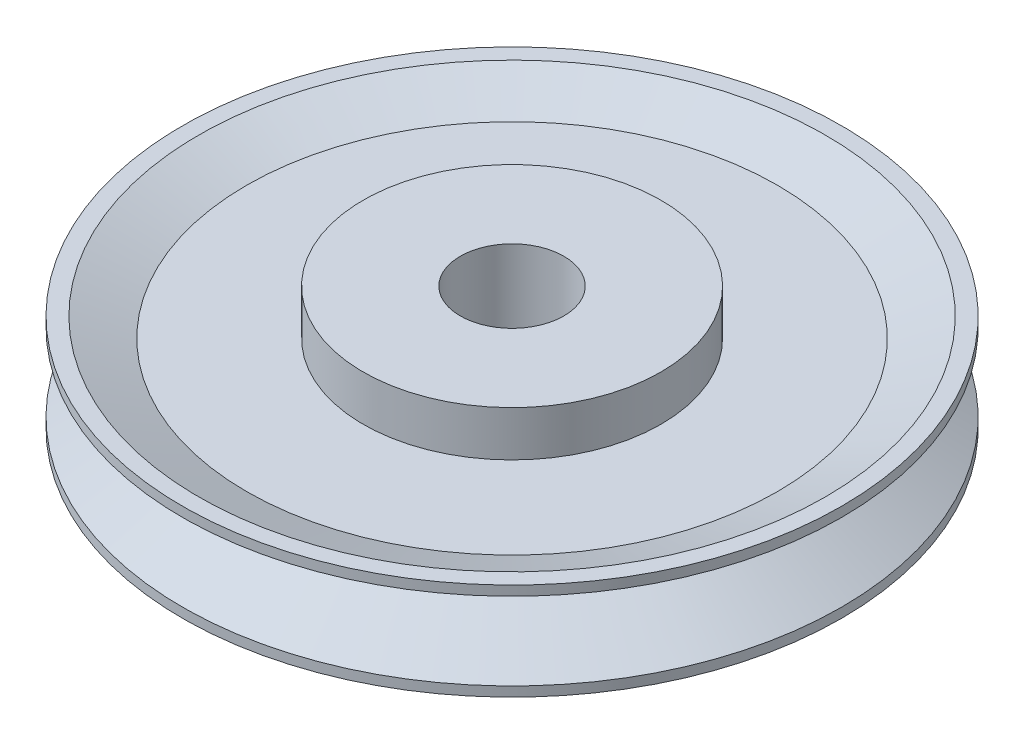
ISO-10303-21;
HEADER;
FILE_DESCRIPTION(('STEP AP214'),'2;1');
FILE_NAME('part.step','',(''),(''),'','','');
FILE_SCHEMA(('AUTOMOTIVE_DESIGN { 1 0 10303 214 1 1 1 1 }'));
ENDSEC;
DATA;
#1=APPLICATION_CONTEXT('core data for automotive mechanical design processes');
#2=APPLICATION_PROTOCOL_DEFINITION('international standard','automotive_design',2000,#1);
#3=PRODUCT_CONTEXT('',#1,'mechanical');
#4=PRODUCT('Part','Part','',(#3));
#5=PRODUCT_RELATED_PRODUCT_CATEGORY('part','',(#4));
#6=PRODUCT_DEFINITION_FORMATION('','',#4);
#7=PRODUCT_DEFINITION_CONTEXT('part definition',#1,'design');
#8=PRODUCT_DEFINITION('design','',#6,#7);
#9=PRODUCT_DEFINITION_SHAPE('','',#8);
#10=(LENGTH_UNIT() NAMED_UNIT(*) SI_UNIT(.MILLI.,.METRE.));
#11=(NAMED_UNIT(*) PLANE_ANGLE_UNIT() SI_UNIT($,.RADIAN.));
#12=(NAMED_UNIT(*) SI_UNIT($,.STERADIAN.) SOLID_ANGLE_UNIT());
#13=UNCERTAINTY_MEASURE_WITH_UNIT(LENGTH_MEASURE(1.E-05),#10,'distance_accuracy_value','');
#14=(GEOMETRIC_REPRESENTATION_CONTEXT(3) GLOBAL_UNCERTAINTY_ASSIGNED_CONTEXT((#13)) GLOBAL_UNIT_ASSIGNED_CONTEXT((#10,
#11,#12)) REPRESENTATION_CONTEXT('',''));
#15=CARTESIAN_POINT('',(0.,0.,0.));
#16=DIRECTION('',(0.,0.,1.));
#17=DIRECTION('',(1.,0.,0.));
#18=AXIS2_PLACEMENT_3D('',#15,#16,#17);
#19=CARTESIAN_POINT('',(-2.03200000000001,-2.54000000000001,0.));
#20=DIRECTION('',(0.,-1.,0.));
#21=DIRECTION('',(1.,0.,0.));
#22=AXIS2_PLACEMENT_3D('',#19,#20,#21);
#23=CYLINDRICAL_SURFACE('',#22,5.842);
#24=CARTESIAN_POINT('',(-2.032,-1.82830729554373,0.));
#25=DIRECTION('',(0.,-1.,0.));
#26=DIRECTION('',(1.,0.,0.));
#27=AXIS2_PLACEMENT_3D('',#24,#25,#26);
#28=CIRCLE('',#27,5.842);
#29=CARTESIAN_POINT('',(3.81,-1.82830729554373,0.));
#30=VERTEX_POINT('',#29);
#31=EDGE_CURVE('E12',#30,#30,#28,.T.);
#32=ORIENTED_EDGE('',*,*,#31,.T.);
#33=EDGE_LOOP('',(#32));
#34=FACE_BOUND('',#33,.T.);
#35=CARTESIAN_POINT('',(-2.032,-3.60630729554365,0.));
#36=DIRECTION('',(0.,-1.,0.));
#37=DIRECTION('',(1.,0.,0.));
#38=AXIS2_PLACEMENT_3D('',#35,#36,#37);
#39=CIRCLE('',#38,5.842);
#40=CARTESIAN_POINT('',(3.81,-3.60630729554365,0.));
#41=VERTEX_POINT('',#40);
#42=EDGE_CURVE('E92',#41,#41,#39,.T.);
#43=ORIENTED_EDGE('',*,*,#42,.F.);
#44=EDGE_LOOP('',(#43));
#45=FACE_BOUND('',#44,.T.);
#46=ADVANCED_FACE('F42',(#34,#45),#23,.T.);
#47=CARTESIAN_POINT('',(0.,-1.82830729554363,0.));
#48=DIRECTION('',(0.,-1.,0.));
#49=DIRECTION('',(1.,0.,0.));
#50=AXIS2_PLACEMENT_3D('',#47,#48,#49);
#51=PLANE('',#50);
#52=CARTESIAN_POINT('',(-2.032,-1.82830729554373,0.));
#53=DIRECTION('',(0.,-1.,0.));
#54=DIRECTION('',(1.,0.,0.));
#55=AXIS2_PLACEMENT_3D('',#52,#53,#54);
#56=CIRCLE('',#55,10.414);
#57=CARTESIAN_POINT('',(8.382,-1.82830729554373,0.));
#58=VERTEX_POINT('',#57);
#59=EDGE_CURVE('E49',#58,#58,#56,.T.);
#60=ORIENTED_EDGE('',*,*,#59,.T.);
#61=EDGE_LOOP('',(#60));
#62=FACE_BOUND('',#61,.T.);
#63=ORIENTED_EDGE('',*,*,#31,.F.);
#64=EDGE_LOOP('',(#63));
#65=FACE_BOUND('',#64,.T.);
#66=ADVANCED_FACE('F44',(#62,#65),#51,.T.);
#67=CARTESIAN_POINT('',(-2.032,-1.82830729554373,0.));
#68=DIRECTION('',(0.,-1.,0.));
#69=DIRECTION('',(1.,0.,0.));
#70=AXIS2_PLACEMENT_3D('',#67,#68,#69);
#71=CONICAL_SURFACE('',#70,10.414,1.18639955229926);
#72=CARTESIAN_POINT('',(-2.032,-2.59030729554366,0.));
#73=DIRECTION('',(0.,-1.,0.));
#74=DIRECTION('',(1.,0.,0.));
#75=AXIS2_PLACEMENT_3D('',#72,#73,#74);
#76=CIRCLE('',#75,12.2977144157223);
#77=CARTESIAN_POINT('',(10.2657144157223,-2.59030729554366,0.));
#78=VERTEX_POINT('',#77);
#79=EDGE_CURVE('E53',#78,#78,#76,.T.);
#80=ORIENTED_EDGE('',*,*,#79,.T.);
#81=EDGE_LOOP('',(#80));
#82=FACE_BOUND('',#81,.T.);
#83=ORIENTED_EDGE('',*,*,#59,.F.);
#84=EDGE_LOOP('',(#83));
#85=FACE_BOUND('',#84,.T.);
#86=ADVANCED_FACE('F105',(#82,#85),#71,.F.);
#87=CARTESIAN_POINT('',(0.,-2.59030729554363,0.));
#88=DIRECTION('',(0.,-1.,0.));
#89=DIRECTION('',(1.,0.,0.));
#90=AXIS2_PLACEMENT_3D('',#87,#88,#89);
#91=PLANE('',#90);
#92=CARTESIAN_POINT('',(-2.032,-2.59030729554366,0.));
#93=DIRECTION('',(0.,-1.,0.));
#94=DIRECTION('',(1.,0.,0.));
#95=AXIS2_PLACEMENT_3D('',#92,#93,#94);
#96=CIRCLE('',#95,12.9327144157223);
#97=CARTESIAN_POINT('',(10.9007144157223,-2.59030729554366,0.));
#98=VERTEX_POINT('',#97);
#99=EDGE_CURVE('E57',#98,#98,#96,.T.);
#100=ORIENTED_EDGE('',*,*,#99,.T.);
#101=EDGE_LOOP('',(#100));
#102=FACE_BOUND('',#101,.T.);
#103=ORIENTED_EDGE('',*,*,#79,.F.);
#104=EDGE_LOOP('',(#103));
#105=FACE_BOUND('',#104,.T.);
#106=ADVANCED_FACE('F151',(#102,#105),#91,.T.);
#107=CARTESIAN_POINT('',(-2.03200000000001,-2.54000000000001,0.));
#108=DIRECTION('',(0.,-1.,0.));
#109=DIRECTION('',(1.,0.,0.));
#110=AXIS2_PLACEMENT_3D('',#107,#108,#109);
#111=CYLINDRICAL_SURFACE('',#110,12.9327144157223);
#112=CARTESIAN_POINT('',(-2.032,-2.20930729554364,0.));
#113=DIRECTION('',(0.,-1.,0.));
#114=DIRECTION('',(1.,0.,0.));
#115=AXIS2_PLACEMENT_3D('',#112,#113,#114);
#116=CIRCLE('',#115,12.9327144157223);
#117=CARTESIAN_POINT('',(10.9007144157223,-2.20930729554364,0.));
#118=VERTEX_POINT('',#117);
#119=EDGE_CURVE('E62',#118,#118,#116,.T.);
#120=ORIENTED_EDGE('',*,*,#119,.T.);
#121=EDGE_LOOP('',(#120));
#122=FACE_BOUND('',#121,.T.);
#123=ORIENTED_EDGE('',*,*,#99,.F.);
#124=EDGE_LOOP('',(#123));
#125=FACE_BOUND('',#124,.T.);
#126=ADVANCED_FACE('F147',(#122,#125),#111,.T.);
#127=CARTESIAN_POINT('',(-2.032,-2.20930729554364,0.));
#128=DIRECTION('',(0.,-1.,0.));
#129=DIRECTION('',(1.,0.,0.));
#130=AXIS2_PLACEMENT_3D('',#127,#128,#129);
#131=CONICAL_SURFACE('',#130,12.9327144157223,1.00129298133675);
#132=CARTESIAN_POINT('',(-2.032,-0.685307295543724,0.));
#133=DIRECTION('',(0.,-1.,0.));
#134=DIRECTION('',(1.,0.,0.));
#135=AXIS2_PLACEMENT_3D('',#132,#133,#134);
#136=CIRCLE('',#135,10.5524614226603);
#137=CARTESIAN_POINT('',(8.52046142266035,-0.685307295543722,0.));
#138=VERTEX_POINT('',#137);
#139=EDGE_CURVE('E65',#138,#138,#136,.T.);
#140=ORIENTED_EDGE('',*,*,#139,.T.);
#141=EDGE_LOOP('',(#140));
#142=FACE_BOUND('',#141,.T.);
#143=ORIENTED_EDGE('',*,*,#119,.F.);
#144=EDGE_LOOP('',(#143));
#145=FACE_BOUND('',#144,.T.);
#146=ADVANCED_FACE('F143',(#142,#145),#131,.T.);
#147=CARTESIAN_POINT('',(-2.032,-0.685307295543724,0.));
#148=DIRECTION('',(0.,1.,0.));
#149=DIRECTION('',(-1.,0.,0.));
#150=AXIS2_PLACEMENT_3D('',#147,#148,#149);
#151=CONICAL_SURFACE('',#150,10.5524614226603,1.00129298133675);
#152=CARTESIAN_POINT('',(-2.032,0.838692704456273,0.));
#153=DIRECTION('',(0.,-1.,0.));
#154=DIRECTION('',(1.,0.,0.));
#155=AXIS2_PLACEMENT_3D('',#152,#153,#154);
#156=CIRCLE('',#155,12.9327144157223);
#157=CARTESIAN_POINT('',(10.9007144157223,0.838692704456276,0.));
#158=VERTEX_POINT('',#157);
#159=EDGE_CURVE('E68',#158,#158,#156,.T.);
#160=ORIENTED_EDGE('',*,*,#159,.T.);
#161=EDGE_LOOP('',(#160));
#162=FACE_BOUND('',#161,.T.);
#163=ORIENTED_EDGE('',*,*,#139,.F.);
#164=EDGE_LOOP('',(#163));
#165=FACE_BOUND('',#164,.T.);
#166=ADVANCED_FACE('F139',(#162,#165),#151,.T.);
#167=CARTESIAN_POINT('',(-2.03200000000001,-2.54000000000001,0.));
#168=DIRECTION('',(0.,-1.,0.));
#169=DIRECTION('',(1.,0.,0.));
#170=AXIS2_PLACEMENT_3D('',#167,#168,#169);
#171=CYLINDRICAL_SURFACE('',#170,12.9327144157223);
#172=CARTESIAN_POINT('',(-2.03200000000001,1.21969270445627,0.));
#173=DIRECTION('',(0.,-1.,0.));
#174=DIRECTION('',(1.,0.,0.));
#175=AXIS2_PLACEMENT_3D('',#172,#173,#174);
#176=CIRCLE('',#175,12.9327144157223);
#177=CARTESIAN_POINT('',(10.9007144157223,1.21969270445627,0.));
#178=VERTEX_POINT('',#177);
#179=EDGE_CURVE('E71',#178,#178,#176,.T.);
#180=ORIENTED_EDGE('',*,*,#179,.T.);
#181=EDGE_LOOP('',(#180));
#182=FACE_BOUND('',#181,.T.);
#183=ORIENTED_EDGE('',*,*,#159,.F.);
#184=EDGE_LOOP('',(#183));
#185=FACE_BOUND('',#184,.T.);
#186=ADVANCED_FACE('F135',(#182,#185),#171,.T.);
#187=CARTESIAN_POINT('',(0.,1.21969270445636,0.));
#188=DIRECTION('',(0.,1.,0.));
#189=DIRECTION('',(-1.,0.,0.));
#190=AXIS2_PLACEMENT_3D('',#187,#188,#189);
#191=PLANE('',#190);
#192=CARTESIAN_POINT('',(-2.03200000000001,1.21969270445627,0.));
#193=DIRECTION('',(0.,-1.,0.));
#194=DIRECTION('',(1.,0.,0.));
#195=AXIS2_PLACEMENT_3D('',#192,#193,#194);
#196=CIRCLE('',#195,12.2977144157223);
#197=CARTESIAN_POINT('',(10.2657144157223,1.21969270445627,0.));
#198=VERTEX_POINT('',#197);
#199=EDGE_CURVE('E74',#198,#198,#196,.T.);
#200=ORIENTED_EDGE('',*,*,#199,.T.);
#201=EDGE_LOOP('',(#200));
#202=FACE_BOUND('',#201,.T.);
#203=ORIENTED_EDGE('',*,*,#179,.F.);
#204=EDGE_LOOP('',(#203));
#205=FACE_BOUND('',#204,.T.);
#206=ADVANCED_FACE('F128',(#202,#205),#191,.T.);
#207=CARTESIAN_POINT('',(-2.03200000000001,0.457692704456267,0.));
#208=DIRECTION('',(0.,1.,0.));
#209=DIRECTION('',(-1.,0.,0.));
#210=AXIS2_PLACEMENT_3D('',#207,#208,#209);
#211=CONICAL_SURFACE('',#210,10.414,1.18639955229926);
#212=ORIENTED_EDGE('',*,*,#199,.F.);
#213=EDGE_LOOP('',(#212));
#214=FACE_BOUND('',#213,.T.);
#215=CARTESIAN_POINT('',(-2.03200000000001,0.457692704456267,0.));
#216=DIRECTION('',(0.,-1.,0.));
#217=DIRECTION('',(1.,0.,0.));
#218=AXIS2_PLACEMENT_3D('',#215,#216,#217);
#219=CIRCLE('',#218,10.414);
#220=CARTESIAN_POINT('',(8.38199999999999,0.457692704456269,0.));
#221=VERTEX_POINT('',#220);
#222=EDGE_CURVE('E77',#221,#221,#219,.T.);
#223=ORIENTED_EDGE('',*,*,#222,.T.);
#224=EDGE_LOOP('',(#223));
#225=FACE_BOUND('',#224,.T.);
#226=ADVANCED_FACE('F118',(#214,#225),#211,.F.);
#227=CARTESIAN_POINT('',(0.,0.457692704456364,0.));
#228=DIRECTION('',(0.,-1.,0.));
#229=DIRECTION('',(1.,0.,0.));
#230=AXIS2_PLACEMENT_3D('',#227,#228,#229);
#231=PLANE('',#230);
#232=ORIENTED_EDGE('',*,*,#222,.F.);
#233=EDGE_LOOP('',(#232));
#234=FACE_BOUND('',#233,.T.);
#235=CARTESIAN_POINT('',(-2.03200000000001,0.457692704456267,0.));
#236=DIRECTION('',(0.,-1.,0.));
#237=DIRECTION('',(1.,0.,0.));
#238=AXIS2_PLACEMENT_3D('',#235,#236,#237);
#239=CIRCLE('',#238,5.842);
#240=CARTESIAN_POINT('',(3.80999999999999,0.457692704456268,0.));
#241=VERTEX_POINT('',#240);
#242=EDGE_CURVE('E80',#241,#241,#239,.T.);
#243=ORIENTED_EDGE('',*,*,#242,.T.);
#244=EDGE_LOOP('',(#243));
#245=FACE_BOUND('',#244,.T.);
#246=ADVANCED_FACE('F110',(#234,#245),#231,.F.);
#247=CARTESIAN_POINT('',(-2.03200000000001,2.23569270445637,0.));
#248=DIRECTION('',(0.,-1.,0.));
#249=DIRECTION('',(1.,0.,0.));
#250=AXIS2_PLACEMENT_3D('',#247,#248,#249);
#251=CIRCLE('',#250,5.842);
#252=CARTESIAN_POINT('',(3.80999999999999,2.23569270445637,0.));
#253=VERTEX_POINT('',#252);
#254=EDGE_CURVE('E83',#253,#253,#251,.T.);
#255=ORIENTED_EDGE('',*,*,#254,.T.);
#256=EDGE_LOOP('',(#255));
#257=FACE_BOUND('',#256,.T.);
#258=ORIENTED_EDGE('',*,*,#242,.F.);
#259=EDGE_LOOP('',(#258));
#260=FACE_BOUND('',#259,.T.);
#261=ADVANCED_FACE('F101',(#257,#260),#23,.T.);
#262=CARTESIAN_POINT('',(0.,2.23569270445637,0.));
#263=DIRECTION('',(0.,1.,0.));
#264=DIRECTION('',(-1.,0.,0.));
#265=AXIS2_PLACEMENT_3D('',#262,#263,#264);
#266=PLANE('',#265);
#267=CARTESIAN_POINT('',(-2.03200000000001,2.23569270445637,0.));
#268=DIRECTION('',(0.,-1.,0.));
#269=DIRECTION('',(1.,0.,0.));
#270=AXIS2_PLACEMENT_3D('',#267,#268,#269);
#271=CIRCLE('',#270,2.032);
#272=CARTESIAN_POINT('',(0.,2.23569270445637,0.));
#273=VERTEX_POINT('',#272);
#274=EDGE_CURVE('E86',#273,#273,#271,.T.);
#275=ORIENTED_EDGE('',*,*,#274,.T.);
#276=EDGE_LOOP('',(#275));
#277=FACE_BOUND('',#276,.T.);
#278=ORIENTED_EDGE('',*,*,#254,.F.);
#279=EDGE_LOOP('',(#278));
#280=FACE_BOUND('',#279,.T.);
#281=ADVANCED_FACE('F109',(#277,#280),#266,.T.);
#282=CARTESIAN_POINT('',(-2.03200000000001,-2.54000000000001,0.));
#283=DIRECTION('',(0.,-1.,0.));
#284=DIRECTION('',(1.,0.,0.));
#285=AXIS2_PLACEMENT_3D('',#282,#283,#284);
#286=CYLINDRICAL_SURFACE('',#285,2.032);
#287=CARTESIAN_POINT('',(-2.032,-3.60630729554365,0.));
#288=DIRECTION('',(0.,-1.,0.));
#289=DIRECTION('',(1.,0.,0.));
#290=AXIS2_PLACEMENT_3D('',#287,#288,#289);
#291=CIRCLE('',#290,2.032);
#292=CARTESIAN_POINT('',(0.,-3.60630729554365,0.));
#293=VERTEX_POINT('',#292);
#294=EDGE_CURVE('E89',#293,#293,#291,.T.);
#295=ORIENTED_EDGE('',*,*,#294,.T.);
#296=EDGE_LOOP('',(#295));
#297=FACE_BOUND('',#296,.T.);
#298=ORIENTED_EDGE('',*,*,#274,.F.);
#299=EDGE_LOOP('',(#298));
#300=FACE_BOUND('',#299,.T.);
#301=ADVANCED_FACE('F116',(#297,#300),#286,.F.);
#302=CARTESIAN_POINT('',(0.,-3.60630729554363,0.));
#303=DIRECTION('',(0.,-1.,0.));
#304=DIRECTION('',(1.,0.,0.));
#305=AXIS2_PLACEMENT_3D('',#302,#303,#304);
#306=PLANE('',#305);
#307=ORIENTED_EDGE('',*,*,#42,.T.);
#308=EDGE_LOOP('',(#307));
#309=FACE_BOUND('',#308,.T.);
#310=ORIENTED_EDGE('',*,*,#294,.F.);
#311=EDGE_LOOP('',(#310));
#312=FACE_BOUND('',#311,.T.);
#313=ADVANCED_FACE('F96',(#309,#312),#306,.T.);
#314=CLOSED_SHELL('',(#46,#66,#86,#106,#126,#146,#166,#186,#206,#226,#246,#261,#281,#301,#313));
#315=MANIFOLD_SOLID_BREP('B2',#314);
#316=ADVANCED_BREP_SHAPE_REPRESENTATION('',(#18,#315),#14);
#317=SHAPE_DEFINITION_REPRESENTATION(#9,#316);
ENDSEC;
END-ISO-10303-21;
